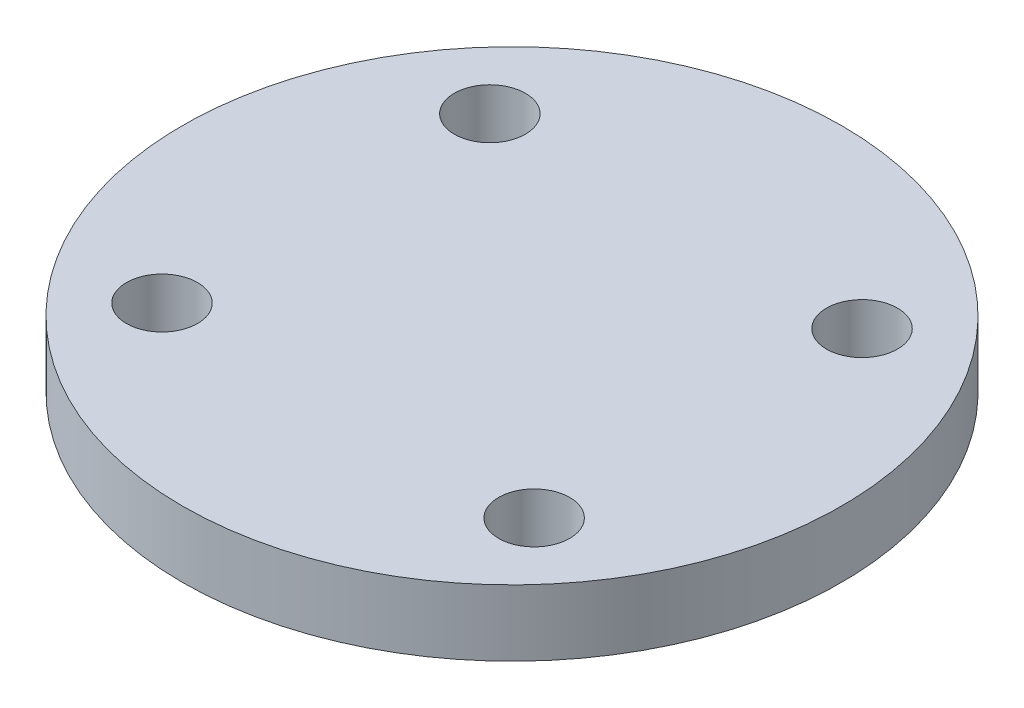
ISO-10303-21;
HEADER;
FILE_DESCRIPTION(('STEP AP214'),'2;1');
FILE_NAME('part.step','',(''),(''),'','','');
FILE_SCHEMA(('AUTOMOTIVE_DESIGN { 1 0 10303 214 1 1 1 1 }'));
ENDSEC;
DATA;
#1=APPLICATION_CONTEXT('core data for automotive mechanical design processes');
#2=APPLICATION_PROTOCOL_DEFINITION('international standard','automotive_design',2000,#1);
#3=PRODUCT_CONTEXT('',#1,'mechanical');
#4=PRODUCT('Part','Part','',(#3));
#5=PRODUCT_RELATED_PRODUCT_CATEGORY('part','',(#4));
#6=PRODUCT_DEFINITION_FORMATION('','',#4);
#7=PRODUCT_DEFINITION_CONTEXT('part definition',#1,'design');
#8=PRODUCT_DEFINITION('design','',#6,#7);
#9=PRODUCT_DEFINITION_SHAPE('','',#8);
#10=(LENGTH_UNIT() NAMED_UNIT(*) SI_UNIT(.MILLI.,.METRE.));
#11=(NAMED_UNIT(*) PLANE_ANGLE_UNIT() SI_UNIT($,.RADIAN.));
#12=(NAMED_UNIT(*) SI_UNIT($,.STERADIAN.) SOLID_ANGLE_UNIT());
#13=UNCERTAINTY_MEASURE_WITH_UNIT(LENGTH_MEASURE(1.E-05),#10,'distance_accuracy_value','');
#14=(GEOMETRIC_REPRESENTATION_CONTEXT(3) GLOBAL_UNCERTAINTY_ASSIGNED_CONTEXT((#13)) GLOBAL_UNIT_ASSIGNED_CONTEXT((#10,
#11,#12)) REPRESENTATION_CONTEXT('',''));
#15=CARTESIAN_POINT('',(0.,0.,0.));
#16=DIRECTION('',(0.,0.,1.));
#17=DIRECTION('',(1.,0.,0.));
#18=AXIS2_PLACEMENT_3D('',#15,#16,#17);
#19=CARTESIAN_POINT('',(0.,4.,0.));
#20=DIRECTION('',(0.,1.,0.));
#21=DIRECTION('',(0.,0.,1.));
#22=AXIS2_PLACEMENT_3D('',#19,#20,#21);
#23=PLANE('',#22);
#24=CARTESIAN_POINT('',(-11.2553849225262,4.,9.91545814603494));
#25=DIRECTION('',(0.,1.,0.));
#26=DIRECTION('',(0.,0.,1.));
#27=AXIS2_PLACEMENT_3D('',#24,#25,#26);
#28=CIRCLE('',#27,2.15);
#29=CARTESIAN_POINT('',(-11.2553849225262,4.,12.0654581460349));
#30=VERTEX_POINT('',#29);
#31=EDGE_CURVE('E53',#30,#30,#28,.T.);
#32=ORIENTED_EDGE('',*,*,#31,.F.);
#33=EDGE_LOOP('',(#32));
#34=FACE_BOUND('',#33,.T.);
#35=CARTESIAN_POINT('',(11.2553849225262,4.,-9.91545814603494));
#36=DIRECTION('',(0.,1.,0.));
#37=DIRECTION('',(0.,0.,1.));
#38=AXIS2_PLACEMENT_3D('',#35,#36,#37);
#39=CIRCLE('',#38,2.15);
#40=CARTESIAN_POINT('',(11.2553849225262,4.,-7.76545814603494));
#41=VERTEX_POINT('',#40);
#42=EDGE_CURVE('E42',#41,#41,#39,.T.);
#43=ORIENTED_EDGE('',*,*,#42,.F.);
#44=EDGE_LOOP('',(#43));
#45=FACE_BOUND('',#44,.T.);
#46=CARTESIAN_POINT('',(0.,4.,0.));
#47=DIRECTION('',(0.,1.,0.));
#48=DIRECTION('',(0.,0.,1.));
#49=AXIS2_PLACEMENT_3D('',#46,#47,#48);
#50=CIRCLE('',#49,19.9332792461007);
#51=CARTESIAN_POINT('',(0.,4.,19.9332792461007));
#52=VERTEX_POINT('',#51);
#53=EDGE_CURVE('E10',#52,#52,#50,.T.);
#54=ORIENTED_EDGE('',*,*,#53,.T.);
#55=EDGE_LOOP('',(#54));
#56=FACE_BOUND('',#55,.T.);
#57=CARTESIAN_POINT('',(11.2553849225262,4.,9.91545814603494));
#58=DIRECTION('',(0.,1.,0.));
#59=DIRECTION('',(0.,0.,1.));
#60=AXIS2_PLACEMENT_3D('',#57,#58,#59);
#61=CIRCLE('',#60,2.15);
#62=CARTESIAN_POINT('',(11.2553849225262,4.,12.0654581460349));
#63=VERTEX_POINT('',#62);
#64=EDGE_CURVE('E47',#63,#63,#61,.T.);
#65=ORIENTED_EDGE('',*,*,#64,.F.);
#66=EDGE_LOOP('',(#65));
#67=FACE_BOUND('',#66,.T.);
#68=CARTESIAN_POINT('',(-11.2553849225262,4.,-9.91545814603494));
#69=DIRECTION('',(0.,1.,0.));
#70=DIRECTION('',(0.,0.,1.));
#71=AXIS2_PLACEMENT_3D('',#68,#69,#70);
#72=CIRCLE('',#71,2.15);
#73=CARTESIAN_POINT('',(-11.2553849225262,4.,-7.76545814603494));
#74=VERTEX_POINT('',#73);
#75=EDGE_CURVE('E59',#74,#74,#72,.T.);
#76=ORIENTED_EDGE('',*,*,#75,.F.);
#77=EDGE_LOOP('',(#76));
#78=FACE_BOUND('',#77,.T.);
#79=ADVANCED_FACE('F31',(#34,#45,#56,#67,#78),#23,.T.);
#80=CARTESIAN_POINT('',(0.,0.,0.));
#81=DIRECTION('',(0.,1.,0.));
#82=DIRECTION('',(0.,0.,1.));
#83=AXIS2_PLACEMENT_3D('',#80,#81,#82);
#84=PLANE('',#83);
#85=CARTESIAN_POINT('',(0.,0.,0.));
#86=DIRECTION('',(0.,1.,0.));
#87=DIRECTION('',(0.,0.,1.));
#88=AXIS2_PLACEMENT_3D('',#85,#86,#87);
#89=CIRCLE('',#88,19.9332792461007);
#90=CARTESIAN_POINT('',(0.,0.,19.9332792461007));
#91=VERTEX_POINT('',#90);
#92=EDGE_CURVE('E35',#91,#91,#89,.T.);
#93=ORIENTED_EDGE('',*,*,#92,.F.);
#94=EDGE_LOOP('',(#93));
#95=FACE_BOUND('',#94,.T.);
#96=CARTESIAN_POINT('',(11.2553849225262,0.,-9.91545814603494));
#97=DIRECTION('',(0.,1.,0.));
#98=DIRECTION('',(0.,0.,1.));
#99=AXIS2_PLACEMENT_3D('',#96,#97,#98);
#100=CIRCLE('',#99,2.15);
#101=CARTESIAN_POINT('',(11.2553849225262,0.,-7.76545814603494));
#102=VERTEX_POINT('',#101);
#103=EDGE_CURVE('E44',#102,#102,#100,.T.);
#104=ORIENTED_EDGE('',*,*,#103,.T.);
#105=EDGE_LOOP('',(#104));
#106=FACE_BOUND('',#105,.T.);
#107=CARTESIAN_POINT('',(11.2553849225262,0.,9.91545814603494));
#108=DIRECTION('',(0.,1.,0.));
#109=DIRECTION('',(0.,0.,1.));
#110=AXIS2_PLACEMENT_3D('',#107,#108,#109);
#111=CIRCLE('',#110,2.15);
#112=CARTESIAN_POINT('',(11.2553849225262,0.,12.0654581460349));
#113=VERTEX_POINT('',#112);
#114=EDGE_CURVE('E50',#113,#113,#111,.T.);
#115=ORIENTED_EDGE('',*,*,#114,.T.);
#116=EDGE_LOOP('',(#115));
#117=FACE_BOUND('',#116,.T.);
#118=CARTESIAN_POINT('',(-11.2553849225262,0.,9.91545814603494));
#119=DIRECTION('',(0.,1.,0.));
#120=DIRECTION('',(0.,0.,1.));
#121=AXIS2_PLACEMENT_3D('',#118,#119,#120);
#122=CIRCLE('',#121,2.15);
#123=CARTESIAN_POINT('',(-11.2553849225262,0.,12.0654581460349));
#124=VERTEX_POINT('',#123);
#125=EDGE_CURVE('E56',#124,#124,#122,.T.);
#126=ORIENTED_EDGE('',*,*,#125,.T.);
#127=EDGE_LOOP('',(#126));
#128=FACE_BOUND('',#127,.T.);
#129=CARTESIAN_POINT('',(-11.2553849225262,0.,-9.91545814603494));
#130=DIRECTION('',(0.,1.,0.));
#131=DIRECTION('',(0.,0.,1.));
#132=AXIS2_PLACEMENT_3D('',#129,#130,#131);
#133=CIRCLE('',#132,2.15);
#134=CARTESIAN_POINT('',(-11.2553849225262,0.,-7.76545814603494));
#135=VERTEX_POINT('',#134);
#136=EDGE_CURVE('E62',#135,#135,#133,.T.);
#137=ORIENTED_EDGE('',*,*,#136,.T.);
#138=EDGE_LOOP('',(#137));
#139=FACE_BOUND('',#138,.T.);
#140=ADVANCED_FACE('F72',(#95,#106,#117,#128,#139),#84,.F.);
#141=CARTESIAN_POINT('',(0.,4.,0.));
#142=DIRECTION('',(0.,-1.,0.));
#143=DIRECTION('',(0.,0.,-1.));
#144=AXIS2_PLACEMENT_3D('',#141,#142,#143);
#145=CYLINDRICAL_SURFACE('',#144,19.9332792461007);
#146=ORIENTED_EDGE('',*,*,#53,.F.);
#147=EDGE_LOOP('',(#146));
#148=FACE_BOUND('',#147,.T.);
#149=ORIENTED_EDGE('',*,*,#92,.T.);
#150=EDGE_LOOP('',(#149));
#151=FACE_BOUND('',#150,.T.);
#152=ADVANCED_FACE('F33',(#148,#151),#145,.T.);
#153=CARTESIAN_POINT('',(11.2553849225262,4.,-9.91545814603494));
#154=DIRECTION('',(0.,-1.,0.));
#155=DIRECTION('',(0.,0.,-1.));
#156=AXIS2_PLACEMENT_3D('',#153,#154,#155);
#157=CYLINDRICAL_SURFACE('',#156,2.15);
#158=ORIENTED_EDGE('',*,*,#42,.T.);
#159=EDGE_LOOP('',(#158));
#160=FACE_BOUND('',#159,.T.);
#161=ORIENTED_EDGE('',*,*,#103,.F.);
#162=EDGE_LOOP('',(#161));
#163=FACE_BOUND('',#162,.T.);
#164=ADVANCED_FACE('F82',(#160,#163),#157,.F.);
#165=CARTESIAN_POINT('',(11.2553849225262,4.,9.91545814603494));
#166=DIRECTION('',(0.,-1.,0.));
#167=DIRECTION('',(0.,0.,-1.));
#168=AXIS2_PLACEMENT_3D('',#165,#166,#167);
#169=CYLINDRICAL_SURFACE('',#168,2.15);
#170=ORIENTED_EDGE('',*,*,#64,.T.);
#171=EDGE_LOOP('',(#170));
#172=FACE_BOUND('',#171,.T.);
#173=ORIENTED_EDGE('',*,*,#114,.F.);
#174=EDGE_LOOP('',(#173));
#175=FACE_BOUND('',#174,.T.);
#176=ADVANCED_FACE('F85',(#172,#175),#169,.F.);
#177=CARTESIAN_POINT('',(-11.2553849225262,4.,9.91545814603494));
#178=DIRECTION('',(0.,-1.,0.));
#179=DIRECTION('',(0.,0.,-1.));
#180=AXIS2_PLACEMENT_3D('',#177,#178,#179);
#181=CYLINDRICAL_SURFACE('',#180,2.15);
#182=ORIENTED_EDGE('',*,*,#31,.T.);
#183=EDGE_LOOP('',(#182));
#184=FACE_BOUND('',#183,.T.);
#185=ORIENTED_EDGE('',*,*,#125,.F.);
#186=EDGE_LOOP('',(#185));
#187=FACE_BOUND('',#186,.T.);
#188=ADVANCED_FACE('F89',(#184,#187),#181,.F.);
#189=CARTESIAN_POINT('',(-11.2553849225262,4.,-9.91545814603494));
#190=DIRECTION('',(0.,-1.,0.));
#191=DIRECTION('',(0.,0.,-1.));
#192=AXIS2_PLACEMENT_3D('',#189,#190,#191);
#193=CYLINDRICAL_SURFACE('',#192,2.15);
#194=ORIENTED_EDGE('',*,*,#75,.T.);
#195=EDGE_LOOP('',(#194));
#196=FACE_BOUND('',#195,.T.);
#197=ORIENTED_EDGE('',*,*,#136,.F.);
#198=EDGE_LOOP('',(#197));
#199=FACE_BOUND('',#198,.T.);
#200=ADVANCED_FACE('F68',(#196,#199),#193,.F.);
#201=CLOSED_SHELL('',(#79,#140,#152,#164,#176,#188,#200));
#202=MANIFOLD_SOLID_BREP('B2',#201);
#203=ADVANCED_BREP_SHAPE_REPRESENTATION('',(#18,#202),#14);
#204=SHAPE_DEFINITION_REPRESENTATION(#9,#203);
ENDSEC;
END-ISO-10303-21;
